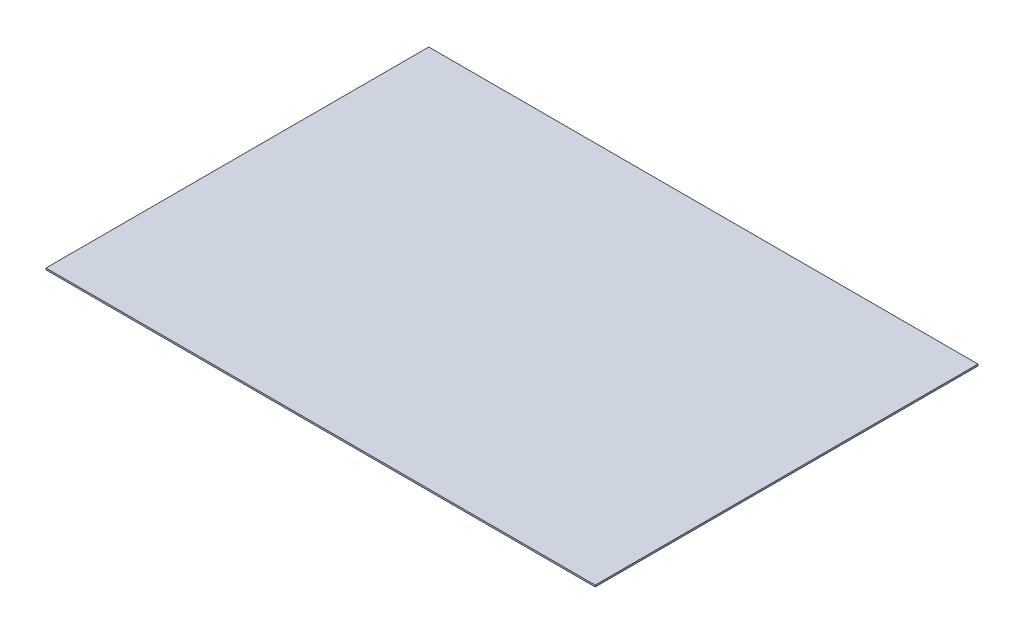
ISO-10303-21;
HEADER;
FILE_DESCRIPTION(('STEP AP214'),'2;1');
FILE_NAME('part.step','',(''),(''),'','','');
FILE_SCHEMA(('AUTOMOTIVE_DESIGN { 1 0 10303 214 1 1 1 1 }'));
ENDSEC;
DATA;
#1=APPLICATION_CONTEXT('core data for automotive mechanical design processes');
#2=APPLICATION_PROTOCOL_DEFINITION('international standard','automotive_design',2000,#1);
#3=PRODUCT_CONTEXT('',#1,'mechanical');
#4=PRODUCT('Part','Part','',(#3));
#5=PRODUCT_RELATED_PRODUCT_CATEGORY('part','',(#4));
#6=PRODUCT_DEFINITION_FORMATION('','',#4);
#7=PRODUCT_DEFINITION_CONTEXT('part definition',#1,'design');
#8=PRODUCT_DEFINITION('design','',#6,#7);
#9=PRODUCT_DEFINITION_SHAPE('','',#8);
#10=(LENGTH_UNIT() NAMED_UNIT(*) SI_UNIT(.MILLI.,.METRE.));
#11=(NAMED_UNIT(*) PLANE_ANGLE_UNIT() SI_UNIT($,.RADIAN.));
#12=(NAMED_UNIT(*) SI_UNIT($,.STERADIAN.) SOLID_ANGLE_UNIT());
#13=UNCERTAINTY_MEASURE_WITH_UNIT(LENGTH_MEASURE(1.E-05),#10,'distance_accuracy_value','');
#14=(GEOMETRIC_REPRESENTATION_CONTEXT(3) GLOBAL_UNCERTAINTY_ASSIGNED_CONTEXT((#13)) GLOBAL_UNIT_ASSIGNED_CONTEXT((#10,
#11,#12)) REPRESENTATION_CONTEXT('',''));
#15=CARTESIAN_POINT('',(0.,0.,0.));
#16=DIRECTION('',(0.,0.,1.));
#17=DIRECTION('',(1.,0.,0.));
#18=AXIS2_PLACEMENT_3D('',#15,#16,#17);
#19=CARTESIAN_POINT('',(0.,0.,0.));
#20=DIRECTION('',(0.,-1.,0.));
#21=DIRECTION('',(0.,0.,-1.));
#22=AXIS2_PLACEMENT_3D('',#19,#20,#21);
#23=PLANE('',#22);
#24=DIRECTION('',(0.,0.,-1.));
#25=VECTOR('',#24,1.);
#26=CARTESIAN_POINT('',(-16.5,0.,11.5));
#27=LINE('',#26,#25);
#28=CARTESIAN_POINT('',(-16.5,0.,11.5));
#29=VERTEX_POINT('',#28);
#30=CARTESIAN_POINT('',(-16.5,0.,-11.5));
#31=VERTEX_POINT('',#30);
#32=EDGE_CURVE('E55',#29,#31,#27,.T.);
#33=ORIENTED_EDGE('',*,*,#32,.T.);
#34=DIRECTION('',(1.,0.,0.));
#35=VECTOR('',#34,1.);
#36=CARTESIAN_POINT('',(-16.5,0.,-11.5));
#37=LINE('',#36,#35);
#38=CARTESIAN_POINT('',(16.5,0.,-11.5));
#39=VERTEX_POINT('',#38);
#40=EDGE_CURVE('E76',#31,#39,#37,.T.);
#41=ORIENTED_EDGE('',*,*,#40,.T.);
#42=DIRECTION('',(0.,0.,1.));
#43=VECTOR('',#42,1.);
#44=CARTESIAN_POINT('',(16.5,0.,11.5));
#45=LINE('',#44,#43);
#46=CARTESIAN_POINT('',(16.5,0.,11.5));
#47=VERTEX_POINT('',#46);
#48=EDGE_CURVE('E58',#39,#47,#45,.T.);
#49=ORIENTED_EDGE('',*,*,#48,.T.);
#50=DIRECTION('',(-1.,0.,0.));
#51=VECTOR('',#50,1.);
#52=CARTESIAN_POINT('',(-16.5,0.,11.5));
#53=LINE('',#52,#51);
#54=EDGE_CURVE('E20',#47,#29,#53,.T.);
#55=ORIENTED_EDGE('',*,*,#54,.T.);
#56=EDGE_LOOP('',(#33,#41,#49,#55));
#57=FACE_BOUND('',#56,.T.);
#58=ADVANCED_FACE('F17',(#57),#23,.T.);
#59=CARTESIAN_POINT('',(-16.5,0.1,11.5));
#60=DIRECTION('',(0.,0.,-1.));
#61=DIRECTION('',(-1.,0.,0.));
#62=AXIS2_PLACEMENT_3D('',#59,#60,#61);
#63=PLANE('',#62);
#64=DIRECTION('',(0.,1.,0.));
#65=VECTOR('',#64,1.);
#66=CARTESIAN_POINT('',(16.5,0.1,11.5));
#67=LINE('',#66,#65);
#68=CARTESIAN_POINT('',(16.5,0.1,11.5));
#69=VERTEX_POINT('',#68);
#70=EDGE_CURVE('E78',#47,#69,#67,.T.);
#71=ORIENTED_EDGE('',*,*,#70,.T.);
#72=DIRECTION('',(1.,0.,0.));
#73=VECTOR('',#72,1.);
#74=CARTESIAN_POINT('',(0.,0.1,11.5));
#75=LINE('',#74,#73);
#76=CARTESIAN_POINT('',(-16.5,0.1,11.5));
#77=VERTEX_POINT('',#76);
#78=EDGE_CURVE('E73',#69,#77,#75,.F.);
#79=ORIENTED_EDGE('',*,*,#78,.T.);
#80=DIRECTION('',(0.,1.,0.));
#81=VECTOR('',#80,1.);
#82=CARTESIAN_POINT('',(-16.5,0.1,11.5));
#83=LINE('',#82,#81);
#84=EDGE_CURVE('E63',#77,#29,#83,.F.);
#85=ORIENTED_EDGE('',*,*,#84,.T.);
#86=ORIENTED_EDGE('',*,*,#54,.F.);
#87=EDGE_LOOP('',(#71,#79,#85,#86));
#88=FACE_BOUND('',#87,.T.);
#89=ADVANCED_FACE('F72',(#88),#63,.F.);
#90=CARTESIAN_POINT('',(-16.5,0.1,11.5));
#91=DIRECTION('',(1.,0.,0.));
#92=DIRECTION('',(0.,0.,-1.));
#93=AXIS2_PLACEMENT_3D('',#90,#91,#92);
#94=PLANE('',#93);
#95=ORIENTED_EDGE('',*,*,#84,.F.);
#96=DIRECTION('',(0.,0.,-1.));
#97=VECTOR('',#96,1.);
#98=CARTESIAN_POINT('',(-16.5,0.1,0.));
#99=LINE('',#98,#97);
#100=CARTESIAN_POINT('',(-16.5,0.1,-11.5));
#101=VERTEX_POINT('',#100);
#102=EDGE_CURVE('E83',#77,#101,#99,.T.);
#103=ORIENTED_EDGE('',*,*,#102,.T.);
#104=DIRECTION('',(0.,1.,0.));
#105=VECTOR('',#104,1.);
#106=CARTESIAN_POINT('',(-16.5,0.1,-11.5));
#107=LINE('',#106,#105);
#108=EDGE_CURVE('E69',#101,#31,#107,.F.);
#109=ORIENTED_EDGE('',*,*,#108,.T.);
#110=ORIENTED_EDGE('',*,*,#32,.F.);
#111=EDGE_LOOP('',(#95,#103,#109,#110));
#112=FACE_BOUND('',#111,.T.);
#113=ADVANCED_FACE('F66',(#112),#94,.F.);
#114=CARTESIAN_POINT('',(-16.5,0.1,-11.5));
#115=DIRECTION('',(0.,0.,1.));
#116=DIRECTION('',(1.,0.,0.));
#117=AXIS2_PLACEMENT_3D('',#114,#115,#116);
#118=PLANE('',#117);
#119=ORIENTED_EDGE('',*,*,#108,.F.);
#120=DIRECTION('',(1.,0.,0.));
#121=VECTOR('',#120,1.);
#122=CARTESIAN_POINT('',(0.,0.1,-11.5));
#123=LINE('',#122,#121);
#124=CARTESIAN_POINT('',(16.5,0.1,-11.5));
#125=VERTEX_POINT('',#124);
#126=EDGE_CURVE('E26',#101,#125,#123,.T.);
#127=ORIENTED_EDGE('',*,*,#126,.T.);
#128=DIRECTION('',(0.,1.,0.));
#129=VECTOR('',#128,1.);
#130=CARTESIAN_POINT('',(16.5,0.1,-11.5));
#131=LINE('',#130,#129);
#132=EDGE_CURVE('E34',#125,#39,#131,.F.);
#133=ORIENTED_EDGE('',*,*,#132,.T.);
#134=ORIENTED_EDGE('',*,*,#40,.F.);
#135=EDGE_LOOP('',(#119,#127,#133,#134));
#136=FACE_BOUND('',#135,.T.);
#137=ADVANCED_FACE('F88',(#136),#118,.F.);
#138=CARTESIAN_POINT('',(16.5,0.1,11.5));
#139=DIRECTION('',(-1.,0.,0.));
#140=DIRECTION('',(0.,0.,1.));
#141=AXIS2_PLACEMENT_3D('',#138,#139,#140);
#142=PLANE('',#141);
#143=ORIENTED_EDGE('',*,*,#132,.F.);
#144=DIRECTION('',(0.,0.,-1.));
#145=VECTOR('',#144,1.);
#146=CARTESIAN_POINT('',(16.5,0.1,0.));
#147=LINE('',#146,#145);
#148=EDGE_CURVE('E11',#125,#69,#147,.F.);
#149=ORIENTED_EDGE('',*,*,#148,.T.);
#150=ORIENTED_EDGE('',*,*,#70,.F.);
#151=ORIENTED_EDGE('',*,*,#48,.F.);
#152=EDGE_LOOP('',(#143,#149,#150,#151));
#153=FACE_BOUND('',#152,.T.);
#154=ADVANCED_FACE('F91',(#153),#142,.F.);
#155=CARTESIAN_POINT('',(0.,0.1,0.));
#156=DIRECTION('',(0.,-1.,0.));
#157=DIRECTION('',(0.,0.,-1.));
#158=AXIS2_PLACEMENT_3D('',#155,#156,#157);
#159=PLANE('',#158);
#160=ORIENTED_EDGE('',*,*,#126,.F.);
#161=ORIENTED_EDGE('',*,*,#102,.F.);
#162=ORIENTED_EDGE('',*,*,#78,.F.);
#163=ORIENTED_EDGE('',*,*,#148,.F.);
#164=EDGE_LOOP('',(#160,#161,#162,#163));
#165=FACE_BOUND('',#164,.T.);
#166=ADVANCED_FACE('F90',(#165),#159,.F.);
#167=CLOSED_SHELL('',(#58,#89,#113,#137,#154,#166));
#168=MANIFOLD_SOLID_BREP('B1',#167);
#169=ADVANCED_BREP_SHAPE_REPRESENTATION('',(#18,#168),#14);
#170=SHAPE_DEFINITION_REPRESENTATION(#9,#169);
ENDSEC;
END-ISO-10303-21;
